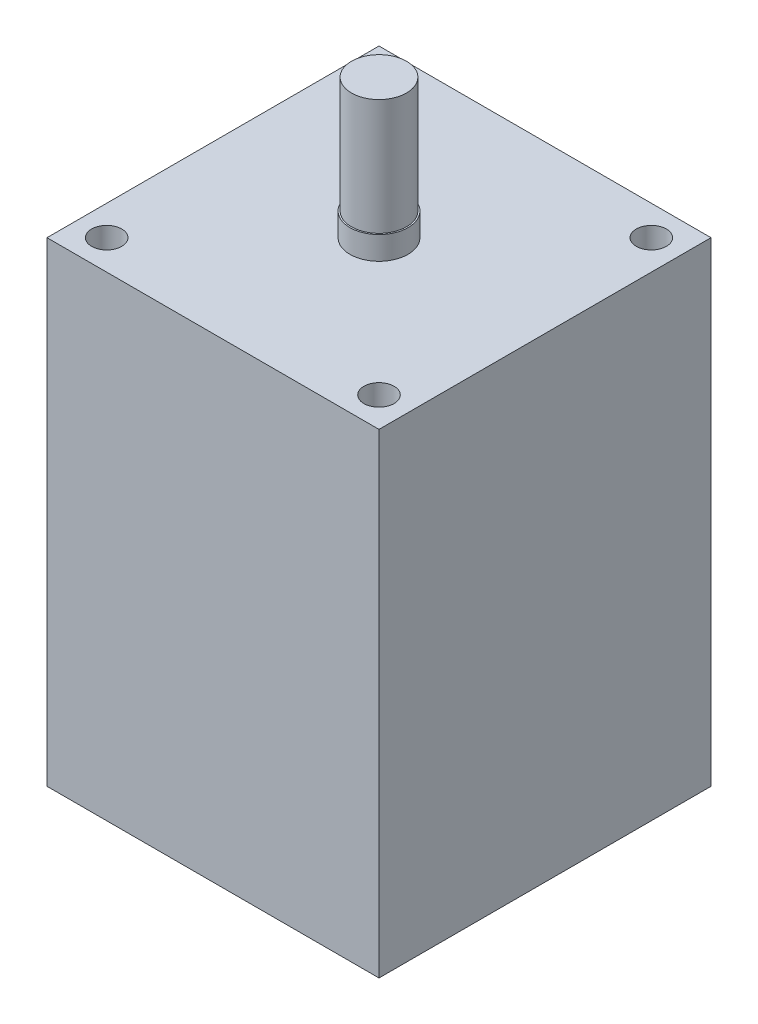
ISO-10303-21;
HEADER;
FILE_DESCRIPTION(('STEP AP214'),'2;1');
FILE_NAME('part.step','',(''),(''),'','','');
FILE_SCHEMA(('AUTOMOTIVE_DESIGN { 1 0 10303 214 1 1 1 1 }'));
ENDSEC;
DATA;
#1=APPLICATION_CONTEXT('core data for automotive mechanical design processes');
#2=APPLICATION_PROTOCOL_DEFINITION('international standard','automotive_design',2000,#1);
#3=PRODUCT_CONTEXT('',#1,'mechanical');
#4=PRODUCT('Part','Part','',(#3));
#5=PRODUCT_RELATED_PRODUCT_CATEGORY('part','',(#4));
#6=PRODUCT_DEFINITION_FORMATION('','',#4);
#7=PRODUCT_DEFINITION_CONTEXT('part definition',#1,'design');
#8=PRODUCT_DEFINITION('design','',#6,#7);
#9=PRODUCT_DEFINITION_SHAPE('','',#8);
#10=(LENGTH_UNIT() NAMED_UNIT(*) SI_UNIT(.MILLI.,.METRE.));
#11=(NAMED_UNIT(*) PLANE_ANGLE_UNIT() SI_UNIT($,.RADIAN.));
#12=(NAMED_UNIT(*) SI_UNIT($,.STERADIAN.) SOLID_ANGLE_UNIT());
#13=UNCERTAINTY_MEASURE_WITH_UNIT(LENGTH_MEASURE(1.E-05),#10,'distance_accuracy_value','');
#14=(GEOMETRIC_REPRESENTATION_CONTEXT(3) GLOBAL_UNCERTAINTY_ASSIGNED_CONTEXT((#13)) GLOBAL_UNIT_ASSIGNED_CONTEXT((#10,
#11,#12)) REPRESENTATION_CONTEXT('',''));
#15=CARTESIAN_POINT('',(0.,0.,0.));
#16=DIRECTION('',(0.,0.,1.));
#17=DIRECTION('',(1.,0.,0.));
#18=AXIS2_PLACEMENT_3D('',#15,#16,#17);
#19=CARTESIAN_POINT('',(28.65,86.,28.65));
#20=DIRECTION('',(0.,1.,0.));
#21=DIRECTION('',(0.,0.,1.));
#22=AXIS2_PLACEMENT_3D('',#19,#20,#21);
#23=PLANE('',#22);
#24=CARTESIAN_POINT('',(28.65,86.,28.65));
#25=DIRECTION('',(0.,1.,0.));
#26=DIRECTION('',(0.,0.,1.));
#27=AXIS2_PLACEMENT_3D('',#24,#25,#26);
#28=CIRCLE('',#27,5.);
#29=CARTESIAN_POINT('',(28.65,86.,33.65));
#30=VERTEX_POINT('',#29);
#31=EDGE_CURVE('E12',#30,#30,#28,.T.);
#32=ORIENTED_EDGE('',*,*,#31,.T.);
#33=EDGE_LOOP('',(#32));
#34=FACE_BOUND('',#33,.T.);
#35=CARTESIAN_POINT('',(28.65,86.,28.65));
#36=DIRECTION('',(0.,1.,0.));
#37=DIRECTION('',(0.,0.,1.));
#38=AXIS2_PLACEMENT_3D('',#35,#36,#37);
#39=CIRCLE('',#38,4.75);
#40=CARTESIAN_POINT('',(28.65,86.,33.4));
#41=VERTEX_POINT('',#40);
#42=EDGE_CURVE('E62',#41,#41,#39,.T.);
#43=ORIENTED_EDGE('',*,*,#42,.F.);
#44=EDGE_LOOP('',(#43));
#45=FACE_BOUND('',#44,.T.);
#46=ADVANCED_FACE('F51',(#34,#45),#23,.T.);
#47=CARTESIAN_POINT('',(28.65,82.,28.65));
#48=DIRECTION('',(0.,1.,0.));
#49=DIRECTION('',(0.,0.,1.));
#50=AXIS2_PLACEMENT_3D('',#47,#48,#49);
#51=PLANE('',#50);
#52=CARTESIAN_POINT('',(28.65,82.,28.65));
#53=DIRECTION('',(0.,1.,0.));
#54=DIRECTION('',(0.,0.,1.));
#55=AXIS2_PLACEMENT_3D('',#52,#53,#54);
#56=CIRCLE('',#55,5.);
#57=CARTESIAN_POINT('',(28.65,82.,33.65));
#58=VERTEX_POINT('',#57);
#59=EDGE_CURVE('E55',#58,#58,#56,.T.);
#60=ORIENTED_EDGE('',*,*,#59,.F.);
#61=EDGE_LOOP('',(#60));
#62=FACE_BOUND('',#61,.T.);
#63=ADVANCED_FACE('F81',(#62),#51,.F.);
#64=CARTESIAN_POINT('',(28.65,86.,28.65));
#65=DIRECTION('',(0.,-1.,0.));
#66=DIRECTION('',(0.,0.,-1.));
#67=AXIS2_PLACEMENT_3D('',#64,#65,#66);
#68=CYLINDRICAL_SURFACE('',#67,5.);
#69=ORIENTED_EDGE('',*,*,#31,.F.);
#70=EDGE_LOOP('',(#69));
#71=FACE_BOUND('',#70,.T.);
#72=ORIENTED_EDGE('',*,*,#59,.T.);
#73=EDGE_LOOP('',(#72));
#74=FACE_BOUND('',#73,.T.);
#75=ADVANCED_FACE('F53',(#71,#74),#68,.T.);
#76=CARTESIAN_POINT('',(28.65,106.,28.65));
#77=DIRECTION('',(0.,-1.,0.));
#78=DIRECTION('',(0.,0.,-1.));
#79=AXIS2_PLACEMENT_3D('',#76,#77,#78);
#80=CYLINDRICAL_SURFACE('',#79,4.75);
#81=ORIENTED_EDGE('',*,*,#42,.T.);
#82=EDGE_LOOP('',(#81));
#83=FACE_BOUND('',#82,.T.);
#84=CARTESIAN_POINT('',(28.65,106.,28.65));
#85=DIRECTION('',(0.,1.,0.));
#86=DIRECTION('',(0.,0.,1.));
#87=AXIS2_PLACEMENT_3D('',#84,#85,#86);
#88=CIRCLE('',#87,4.75);
#89=CARTESIAN_POINT('',(28.65,106.,33.4));
#90=VERTEX_POINT('',#89);
#91=EDGE_CURVE('E66',#90,#90,#88,.T.);
#92=ORIENTED_EDGE('',*,*,#91,.F.);
#93=EDGE_LOOP('',(#92));
#94=FACE_BOUND('',#93,.T.);
#95=ADVANCED_FACE('F72',(#83,#94),#80,.T.);
#96=CARTESIAN_POINT('',(28.65,106.,28.65));
#97=DIRECTION('',(0.,1.,0.));
#98=DIRECTION('',(0.,0.,1.));
#99=AXIS2_PLACEMENT_3D('',#96,#97,#98);
#100=PLANE('',#99);
#101=ORIENTED_EDGE('',*,*,#91,.T.);
#102=EDGE_LOOP('',(#101));
#103=FACE_BOUND('',#102,.T.);
#104=ADVANCED_FACE('F70',(#103),#100,.T.);
#105=CLOSED_SHELL('',(#46,#63,#75,#95,#104));
#106=MANIFOLD_SOLID_BREP('B2',#105);
#107=CARTESIAN_POINT('',(57.2999999999999,82.,0.));
#108=DIRECTION('',(1.,0.,0.));
#109=DIRECTION('',(0.,0.,-1.));
#110=AXIS2_PLACEMENT_3D('',#107,#108,#109);
#111=PLANE('',#110);
#112=DIRECTION('',(0.,0.,1.));
#113=VECTOR('',#112,1.);
#114=CARTESIAN_POINT('',(57.2999999999999,0.,0.));
#115=LINE('',#114,#113);
#116=CARTESIAN_POINT('',(57.2999999999999,0.,0.));
#117=VERTEX_POINT('',#116);
#118=CARTESIAN_POINT('',(57.2999999999999,0.,57.3));
#119=VERTEX_POINT('',#118);
#120=EDGE_CURVE('E208',#117,#119,#115,.T.);
#121=ORIENTED_EDGE('',*,*,#120,.F.);
#122=DIRECTION('',(0.,-1.,0.));
#123=VECTOR('',#122,1.);
#124=CARTESIAN_POINT('',(57.2999999999999,82.,0.));
#125=LINE('',#124,#123);
#126=CARTESIAN_POINT('',(57.2999999999999,82.,0.));
#127=VERTEX_POINT('',#126);
#128=EDGE_CURVE('E49',#127,#117,#125,.T.);
#129=ORIENTED_EDGE('',*,*,#128,.F.);
#130=DIRECTION('',(0.,0.,1.));
#131=VECTOR('',#130,1.);
#132=CARTESIAN_POINT('',(57.2999999999999,82.,0.));
#133=LINE('',#132,#131);
#134=CARTESIAN_POINT('',(57.2999999999999,82.,57.3));
#135=VERTEX_POINT('',#134);
#136=EDGE_CURVE('E186',#127,#135,#133,.T.);
#137=ORIENTED_EDGE('',*,*,#136,.T.);
#138=DIRECTION('',(0.,-1.,0.));
#139=VECTOR('',#138,1.);
#140=CARTESIAN_POINT('',(57.2999999999999,82.,57.3));
#141=LINE('',#140,#139);
#142=EDGE_CURVE('E165',#135,#119,#141,.T.);
#143=ORIENTED_EDGE('',*,*,#142,.T.);
#144=EDGE_LOOP('',(#121,#129,#137,#143));
#145=FACE_BOUND('',#144,.T.);
#146=ADVANCED_FACE('F125',(#145),#111,.T.);
#147=CARTESIAN_POINT('',(0.,82.,0.));
#148=DIRECTION('',(0.,0.,-1.));
#149=DIRECTION('',(-1.,0.,0.));
#150=AXIS2_PLACEMENT_3D('',#147,#148,#149);
#151=PLANE('',#150);
#152=DIRECTION('',(1.,0.,0.));
#153=VECTOR('',#152,1.);
#154=CARTESIAN_POINT('',(0.,0.,0.));
#155=LINE('',#154,#153);
#156=CARTESIAN_POINT('',(0.,0.,0.));
#157=VERTEX_POINT('',#156);
#158=EDGE_CURVE('E177',#157,#117,#155,.T.);
#159=ORIENTED_EDGE('',*,*,#158,.F.);
#160=DIRECTION('',(0.,-1.,0.));
#161=VECTOR('',#160,1.);
#162=CARTESIAN_POINT('',(0.,82.,0.));
#163=LINE('',#162,#161);
#164=CARTESIAN_POINT('',(0.,82.,0.));
#165=VERTEX_POINT('',#164);
#166=EDGE_CURVE('E134',#165,#157,#163,.T.);
#167=ORIENTED_EDGE('',*,*,#166,.F.);
#168=DIRECTION('',(1.,0.,0.));
#169=VECTOR('',#168,1.);
#170=CARTESIAN_POINT('',(0.,82.,0.));
#171=LINE('',#170,#169);
#172=EDGE_CURVE('E175',#165,#127,#171,.T.);
#173=ORIENTED_EDGE('',*,*,#172,.T.);
#174=ORIENTED_EDGE('',*,*,#128,.T.);
#175=EDGE_LOOP('',(#159,#167,#173,#174));
#176=FACE_BOUND('',#175,.T.);
#177=ADVANCED_FACE('F173',(#176),#151,.T.);
#178=CARTESIAN_POINT('',(0.,82.,0.));
#179=DIRECTION('',(1.,0.,0.));
#180=DIRECTION('',(0.,0.,-1.));
#181=AXIS2_PLACEMENT_3D('',#178,#179,#180);
#182=PLANE('',#181);
#183=DIRECTION('',(0.,0.,1.));
#184=VECTOR('',#183,1.);
#185=CARTESIAN_POINT('',(0.,0.,0.));
#186=LINE('',#185,#184);
#187=CARTESIAN_POINT('',(0.,0.,57.2999999999999));
#188=VERTEX_POINT('',#187);
#189=EDGE_CURVE('E211',#157,#188,#186,.T.);
#190=ORIENTED_EDGE('',*,*,#189,.T.);
#191=DIRECTION('',(0.,-1.,0.));
#192=VECTOR('',#191,1.);
#193=CARTESIAN_POINT('',(0.,82.,57.2999999999999));
#194=LINE('',#193,#192);
#195=CARTESIAN_POINT('',(0.,82.,57.2999999999999));
#196=VERTEX_POINT('',#195);
#197=EDGE_CURVE('E180',#196,#188,#194,.T.);
#198=ORIENTED_EDGE('',*,*,#197,.F.);
#199=DIRECTION('',(0.,0.,1.));
#200=VECTOR('',#199,1.);
#201=CARTESIAN_POINT('',(0.,82.,0.));
#202=LINE('',#201,#200);
#203=EDGE_CURVE('E182',#165,#196,#202,.T.);
#204=ORIENTED_EDGE('',*,*,#203,.F.);
#205=ORIENTED_EDGE('',*,*,#166,.T.);
#206=EDGE_LOOP('',(#190,#198,#204,#205));
#207=FACE_BOUND('',#206,.T.);
#208=ADVANCED_FACE('F183',(#207),#182,.F.);
#209=CARTESIAN_POINT('',(5.15,82.,5.15));
#210=DIRECTION('',(0.,-1.,0.));
#211=DIRECTION('',(0.,0.,-1.));
#212=AXIS2_PLACEMENT_3D('',#209,#210,#211);
#213=CYLINDRICAL_SURFACE('',#212,2.6);
#214=CARTESIAN_POINT('',(5.15,82.,5.15));
#215=DIRECTION('',(0.,1.,0.));
#216=DIRECTION('',(0.,0.,1.));
#217=AXIS2_PLACEMENT_3D('',#214,#215,#216);
#218=CIRCLE('',#217,2.6);
#219=CARTESIAN_POINT('',(5.15,82.,7.75));
#220=VERTEX_POINT('',#219);
#221=EDGE_CURVE('E188',#220,#220,#218,.T.);
#222=ORIENTED_EDGE('',*,*,#221,.T.);
#223=EDGE_LOOP('',(#222));
#224=FACE_BOUND('',#223,.T.);
#225=CARTESIAN_POINT('',(5.15,0.,5.15));
#226=DIRECTION('',(0.,1.,0.));
#227=DIRECTION('',(0.,0.,1.));
#228=AXIS2_PLACEMENT_3D('',#225,#226,#227);
#229=CIRCLE('',#228,2.6);
#230=CARTESIAN_POINT('',(5.15,0.,7.75));
#231=VERTEX_POINT('',#230);
#232=EDGE_CURVE('E205',#231,#231,#229,.T.);
#233=ORIENTED_EDGE('',*,*,#232,.F.);
#234=EDGE_LOOP('',(#233));
#235=FACE_BOUND('',#234,.T.);
#236=ADVANCED_FACE('F227',(#224,#235),#213,.F.);
#237=CARTESIAN_POINT('',(52.15,82.,5.15));
#238=DIRECTION('',(0.,-1.,0.));
#239=DIRECTION('',(0.,0.,-1.));
#240=AXIS2_PLACEMENT_3D('',#237,#238,#239);
#241=CYLINDRICAL_SURFACE('',#240,2.6);
#242=CARTESIAN_POINT('',(52.15,82.,5.15));
#243=DIRECTION('',(0.,1.,0.));
#244=DIRECTION('',(0.,0.,1.));
#245=AXIS2_PLACEMENT_3D('',#242,#243,#244);
#246=CIRCLE('',#245,2.6);
#247=CARTESIAN_POINT('',(52.15,82.,7.75));
#248=VERTEX_POINT('',#247);
#249=EDGE_CURVE('E344',#248,#248,#246,.T.);
#250=ORIENTED_EDGE('',*,*,#249,.T.);
#251=EDGE_LOOP('',(#250));
#252=FACE_BOUND('',#251,.T.);
#253=CARTESIAN_POINT('',(52.15,0.,5.15));
#254=DIRECTION('',(0.,1.,0.));
#255=DIRECTION('',(0.,0.,1.));
#256=AXIS2_PLACEMENT_3D('',#253,#254,#255);
#257=CIRCLE('',#256,2.6);
#258=CARTESIAN_POINT('',(52.15,0.,7.75));
#259=VERTEX_POINT('',#258);
#260=EDGE_CURVE('E202',#259,#259,#257,.T.);
#261=ORIENTED_EDGE('',*,*,#260,.F.);
#262=EDGE_LOOP('',(#261));
#263=FACE_BOUND('',#262,.T.);
#264=ADVANCED_FACE('F230',(#252,#263),#241,.F.);
#265=CARTESIAN_POINT('',(5.15,82.,52.15));
#266=DIRECTION('',(0.,-1.,0.));
#267=DIRECTION('',(0.,0.,-1.));
#268=AXIS2_PLACEMENT_3D('',#265,#266,#267);
#269=CYLINDRICAL_SURFACE('',#268,2.60000000000001);
#270=CARTESIAN_POINT('',(5.15,82.,52.15));
#271=DIRECTION('',(0.,1.,0.));
#272=DIRECTION('',(0.,0.,1.));
#273=AXIS2_PLACEMENT_3D('',#270,#271,#272);
#274=CIRCLE('',#273,2.60000000000001);
#275=CARTESIAN_POINT('',(5.15,82.,54.75));
#276=VERTEX_POINT('',#275);
#277=EDGE_CURVE('E340',#276,#276,#274,.T.);
#278=ORIENTED_EDGE('',*,*,#277,.T.);
#279=EDGE_LOOP('',(#278));
#280=FACE_BOUND('',#279,.T.);
#281=CARTESIAN_POINT('',(5.15,0.,52.15));
#282=DIRECTION('',(0.,1.,0.));
#283=DIRECTION('',(0.,0.,1.));
#284=AXIS2_PLACEMENT_3D('',#281,#282,#283);
#285=CIRCLE('',#284,2.60000000000001);
#286=CARTESIAN_POINT('',(5.15,0.,54.75));
#287=VERTEX_POINT('',#286);
#288=EDGE_CURVE('E199',#287,#287,#285,.T.);
#289=ORIENTED_EDGE('',*,*,#288,.F.);
#290=EDGE_LOOP('',(#289));
#291=FACE_BOUND('',#290,.T.);
#292=ADVANCED_FACE('F234',(#280,#291),#269,.F.);
#293=CARTESIAN_POINT('',(52.15,82.,52.15));
#294=DIRECTION('',(0.,-1.,0.));
#295=DIRECTION('',(0.,0.,-1.));
#296=AXIS2_PLACEMENT_3D('',#293,#294,#295);
#297=CYLINDRICAL_SURFACE('',#296,2.6);
#298=CARTESIAN_POINT('',(52.15,82.,52.15));
#299=DIRECTION('',(0.,1.,0.));
#300=DIRECTION('',(0.,0.,1.));
#301=AXIS2_PLACEMENT_3D('',#298,#299,#300);
#302=CIRCLE('',#301,2.6);
#303=CARTESIAN_POINT('',(52.15,82.,54.75));
#304=VERTEX_POINT('',#303);
#305=EDGE_CURVE('E248',#304,#304,#302,.T.);
#306=ORIENTED_EDGE('',*,*,#305,.T.);
#307=EDGE_LOOP('',(#306));
#308=FACE_BOUND('',#307,.T.);
#309=CARTESIAN_POINT('',(52.15,0.,52.15));
#310=DIRECTION('',(0.,1.,0.));
#311=DIRECTION('',(0.,0.,1.));
#312=AXIS2_PLACEMENT_3D('',#309,#310,#311);
#313=CIRCLE('',#312,2.6);
#314=CARTESIAN_POINT('',(52.15,0.,54.75));
#315=VERTEX_POINT('',#314);
#316=EDGE_CURVE('E196',#315,#315,#313,.T.);
#317=ORIENTED_EDGE('',*,*,#316,.F.);
#318=EDGE_LOOP('',(#317));
#319=FACE_BOUND('',#318,.T.);
#320=ADVANCED_FACE('F237',(#308,#319),#297,.F.);
#321=CARTESIAN_POINT('',(28.65,82.,28.65));
#322=DIRECTION('',(0.,-1.,0.));
#323=DIRECTION('',(0.,0.,-1.));
#324=AXIS2_PLACEMENT_3D('',#321,#322,#323);
#325=CYLINDRICAL_SURFACE('',#324,5.);
#326=CARTESIAN_POINT('',(28.65,82.,28.65));
#327=DIRECTION('',(0.,1.,0.));
#328=DIRECTION('',(0.,0.,1.));
#329=AXIS2_PLACEMENT_3D('',#326,#327,#328);
#330=CIRCLE('',#329,5.);
#331=CARTESIAN_POINT('',(28.65,82.,33.65));
#332=VERTEX_POINT('',#331);
#333=EDGE_CURVE('E214',#332,#332,#330,.T.);
#334=ORIENTED_EDGE('',*,*,#333,.T.);
#335=EDGE_LOOP('',(#334));
#336=FACE_BOUND('',#335,.T.);
#337=CARTESIAN_POINT('',(28.65,0.,28.65));
#338=DIRECTION('',(0.,1.,0.));
#339=DIRECTION('',(0.,0.,1.));
#340=AXIS2_PLACEMENT_3D('',#337,#338,#339);
#341=CIRCLE('',#340,5.);
#342=CARTESIAN_POINT('',(28.65,0.,33.65));
#343=VERTEX_POINT('',#342);
#344=EDGE_CURVE('E193',#343,#343,#341,.T.);
#345=ORIENTED_EDGE('',*,*,#344,.F.);
#346=EDGE_LOOP('',(#345));
#347=FACE_BOUND('',#346,.T.);
#348=ADVANCED_FACE('F127',(#336,#347),#325,.F.);
#349=CARTESIAN_POINT('',(0.,82.,57.2999999999999));
#350=DIRECTION('',(0.,0.,-1.));
#351=DIRECTION('',(-1.,0.,0.));
#352=AXIS2_PLACEMENT_3D('',#349,#350,#351);
#353=PLANE('',#352);
#354=DIRECTION('',(1.,0.,0.));
#355=VECTOR('',#354,1.);
#356=CARTESIAN_POINT('',(0.,0.,57.2999999999999));
#357=LINE('',#356,#355);
#358=EDGE_CURVE('E158',#188,#119,#357,.T.);
#359=ORIENTED_EDGE('',*,*,#358,.T.);
#360=ORIENTED_EDGE('',*,*,#142,.F.);
#361=DIRECTION('',(1.,0.,0.));
#362=VECTOR('',#361,1.);
#363=CARTESIAN_POINT('',(0.,82.,57.2999999999999));
#364=LINE('',#363,#362);
#365=EDGE_CURVE('E142',#196,#135,#364,.T.);
#366=ORIENTED_EDGE('',*,*,#365,.F.);
#367=ORIENTED_EDGE('',*,*,#197,.T.);
#368=EDGE_LOOP('',(#359,#360,#366,#367));
#369=FACE_BOUND('',#368,.T.);
#370=ADVANCED_FACE('F217',(#369),#353,.F.);
#371=CARTESIAN_POINT('',(0.,82.,0.));
#372=DIRECTION('',(0.,1.,0.));
#373=DIRECTION('',(0.,0.,1.));
#374=AXIS2_PLACEMENT_3D('',#371,#372,#373);
#375=PLANE('',#374);
#376=ORIENTED_EDGE('',*,*,#333,.F.);
#377=EDGE_LOOP('',(#376));
#378=FACE_BOUND('',#377,.T.);
#379=ORIENTED_EDGE('',*,*,#305,.F.);
#380=EDGE_LOOP('',(#379));
#381=FACE_BOUND('',#380,.T.);
#382=ORIENTED_EDGE('',*,*,#277,.F.);
#383=EDGE_LOOP('',(#382));
#384=FACE_BOUND('',#383,.T.);
#385=ORIENTED_EDGE('',*,*,#249,.F.);
#386=EDGE_LOOP('',(#385));
#387=FACE_BOUND('',#386,.T.);
#388=ORIENTED_EDGE('',*,*,#221,.F.);
#389=EDGE_LOOP('',(#388));
#390=FACE_BOUND('',#389,.T.);
#391=ORIENTED_EDGE('',*,*,#136,.F.);
#392=ORIENTED_EDGE('',*,*,#172,.F.);
#393=ORIENTED_EDGE('',*,*,#203,.T.);
#394=ORIENTED_EDGE('',*,*,#365,.T.);
#395=EDGE_LOOP('',(#391,#392,#393,#394));
#396=FACE_BOUND('',#395,.T.);
#397=ADVANCED_FACE('F185',(#378,#381,#384,#387,#390,#396),#375,.T.);
#398=CARTESIAN_POINT('',(0.,0.,0.));
#399=DIRECTION('',(0.,1.,0.));
#400=DIRECTION('',(0.,0.,1.));
#401=AXIS2_PLACEMENT_3D('',#398,#399,#400);
#402=PLANE('',#401);
#403=ORIENTED_EDGE('',*,*,#344,.T.);
#404=EDGE_LOOP('',(#403));
#405=FACE_BOUND('',#404,.T.);
#406=ORIENTED_EDGE('',*,*,#316,.T.);
#407=EDGE_LOOP('',(#406));
#408=FACE_BOUND('',#407,.T.);
#409=ORIENTED_EDGE('',*,*,#288,.T.);
#410=EDGE_LOOP('',(#409));
#411=FACE_BOUND('',#410,.T.);
#412=ORIENTED_EDGE('',*,*,#260,.T.);
#413=EDGE_LOOP('',(#412));
#414=FACE_BOUND('',#413,.T.);
#415=ORIENTED_EDGE('',*,*,#232,.T.);
#416=EDGE_LOOP('',(#415));
#417=FACE_BOUND('',#416,.T.);
#418=ORIENTED_EDGE('',*,*,#120,.T.);
#419=ORIENTED_EDGE('',*,*,#358,.F.);
#420=ORIENTED_EDGE('',*,*,#189,.F.);
#421=ORIENTED_EDGE('',*,*,#158,.T.);
#422=EDGE_LOOP('',(#418,#419,#420,#421));
#423=FACE_BOUND('',#422,.T.);
#424=ADVANCED_FACE('F218',(#405,#408,#411,#414,#417,#423),#402,.F.);
#425=CLOSED_SHELL('',(#146,#177,#208,#236,#264,#292,#320,#348,#370,#397,#424));
#426=MANIFOLD_SOLID_BREP('B7',#425);
#427=ADVANCED_BREP_SHAPE_REPRESENTATION('',(#18,#106,#426),#14);
#428=SHAPE_DEFINITION_REPRESENTATION(#9,#427);
ENDSEC;
END-ISO-10303-21;
